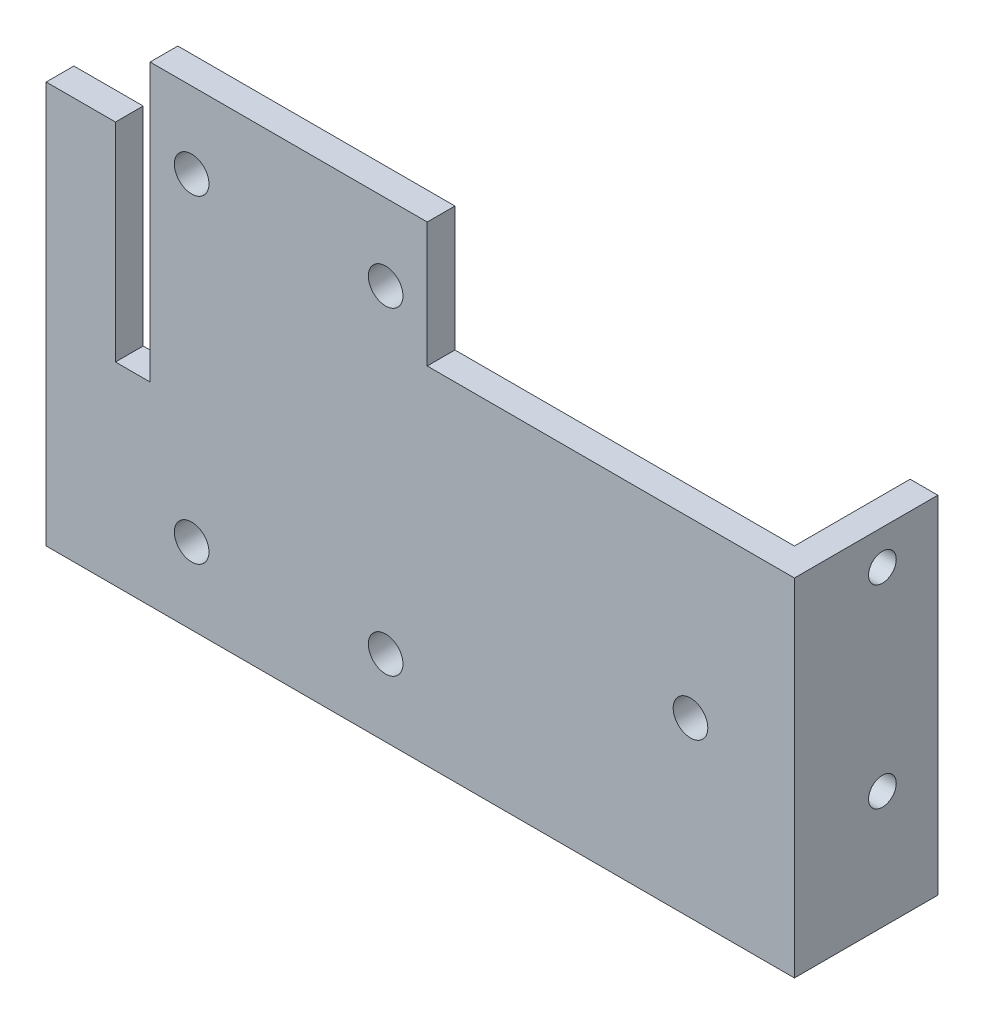
ISO-10303-21;
HEADER;
FILE_DESCRIPTION(('STEP AP214'),'2;1');
FILE_NAME('part.step','',(''),(''),'','','');
FILE_SCHEMA(('AUTOMOTIVE_DESIGN { 1 0 10303 214 1 1 1 1 }'));
ENDSEC;
DATA;
#1=APPLICATION_CONTEXT('core data for automotive mechanical design processes');
#2=APPLICATION_PROTOCOL_DEFINITION('international standard','automotive_design',2000,#1);
#3=PRODUCT_CONTEXT('',#1,'mechanical');
#4=PRODUCT('Part','Part','',(#3));
#5=PRODUCT_RELATED_PRODUCT_CATEGORY('part','',(#4));
#6=PRODUCT_DEFINITION_FORMATION('','',#4);
#7=PRODUCT_DEFINITION_CONTEXT('part definition',#1,'design');
#8=PRODUCT_DEFINITION('design','',#6,#7);
#9=PRODUCT_DEFINITION_SHAPE('','',#8);
#10=(LENGTH_UNIT() NAMED_UNIT(*) SI_UNIT(.MILLI.,.METRE.));
#11=(NAMED_UNIT(*) PLANE_ANGLE_UNIT() SI_UNIT($,.RADIAN.));
#12=(NAMED_UNIT(*) SI_UNIT($,.STERADIAN.) SOLID_ANGLE_UNIT());
#13=UNCERTAINTY_MEASURE_WITH_UNIT(LENGTH_MEASURE(1.E-05),#10,'distance_accuracy_value','');
#14=(GEOMETRIC_REPRESENTATION_CONTEXT(3) GLOBAL_UNCERTAINTY_ASSIGNED_CONTEXT((#13)) GLOBAL_UNIT_ASSIGNED_CONTEXT((#10,
#11,#12)) REPRESENTATION_CONTEXT('',''));
#15=CARTESIAN_POINT('',(0.,0.,0.));
#16=DIRECTION('',(0.,0.,1.));
#17=DIRECTION('',(1.,0.,0.));
#18=AXIS2_PLACEMENT_3D('',#15,#16,#17);
#19=CARTESIAN_POINT('',(0.,0.,4.));
#20=DIRECTION('',(0.,0.,-1.));
#21=DIRECTION('',(-1.,0.,0.));
#22=AXIS2_PLACEMENT_3D('',#19,#20,#21);
#23=PLANE('',#22);
#24=DIRECTION('',(0.,1.,0.));
#25=VECTOR('',#24,1.);
#26=CARTESIAN_POINT('',(9.99999999999999,0.,4.));
#27=LINE('',#26,#25);
#28=CARTESIAN_POINT('',(9.99999999999999,28.,4.));
#29=VERTEX_POINT('',#28);
#30=CARTESIAN_POINT('',(10.,58.,4.));
#31=VERTEX_POINT('',#30);
#32=EDGE_CURVE('E179',#29,#31,#27,.T.);
#33=ORIENTED_EDGE('',*,*,#32,.T.);
#34=DIRECTION('',(-1.,0.,0.));
#35=VECTOR('',#34,1.);
#36=CARTESIAN_POINT('',(0.,58.,4.));
#37=LINE('',#36,#35);
#38=CARTESIAN_POINT('',(0.,58.,4.));
#39=VERTEX_POINT('',#38);
#40=EDGE_CURVE('E282',#31,#39,#37,.T.);
#41=ORIENTED_EDGE('',*,*,#40,.T.);
#42=DIRECTION('',(0.,-1.,0.));
#43=VECTOR('',#42,1.);
#44=CARTESIAN_POINT('',(0.,0.,4.));
#45=LINE('',#44,#43);
#46=CARTESIAN_POINT('',(0.,0.,4.));
#47=VERTEX_POINT('',#46);
#48=EDGE_CURVE('E147',#39,#47,#45,.T.);
#49=ORIENTED_EDGE('',*,*,#48,.T.);
#50=DIRECTION('',(1.,0.,0.));
#51=VECTOR('',#50,1.);
#52=CARTESIAN_POINT('',(0.,0.,4.));
#53=LINE('',#52,#51);
#54=CARTESIAN_POINT('',(108.,0.,4.));
#55=VERTEX_POINT('',#54);
#56=EDGE_CURVE('E150',#47,#55,#53,.T.);
#57=ORIENTED_EDGE('',*,*,#56,.T.);
#58=DIRECTION('',(0.,1.,0.));
#59=VECTOR('',#58,1.);
#60=CARTESIAN_POINT('',(108.,0.,4.));
#61=LINE('',#60,#59);
#62=CARTESIAN_POINT('',(108.,50.,4.));
#63=VERTEX_POINT('',#62);
#64=EDGE_CURVE('E235',#55,#63,#61,.T.);
#65=ORIENTED_EDGE('',*,*,#64,.T.);
#66=DIRECTION('',(-1.,0.,0.));
#67=VECTOR('',#66,1.);
#68=CARTESIAN_POINT('',(55.,50.,4.));
#69=LINE('',#68,#67);
#70=CARTESIAN_POINT('',(55.,50.,4.));
#71=VERTEX_POINT('',#70);
#72=EDGE_CURVE('E237',#63,#71,#69,.T.);
#73=ORIENTED_EDGE('',*,*,#72,.T.);
#74=DIRECTION('',(0.,1.,0.));
#75=VECTOR('',#74,1.);
#76=CARTESIAN_POINT('',(55.,68.,4.));
#77=LINE('',#76,#75);
#78=CARTESIAN_POINT('',(55.,68.,4.));
#79=VERTEX_POINT('',#78);
#80=EDGE_CURVE('E239',#71,#79,#77,.T.);
#81=ORIENTED_EDGE('',*,*,#80,.T.);
#82=DIRECTION('',(-1.,0.,0.));
#83=VECTOR('',#82,1.);
#84=CARTESIAN_POINT('',(0.,68.,4.));
#85=LINE('',#84,#83);
#86=CARTESIAN_POINT('',(15.,68.,4.));
#87=VERTEX_POINT('',#86);
#88=EDGE_CURVE('E158',#79,#87,#85,.T.);
#89=ORIENTED_EDGE('',*,*,#88,.T.);
#90=DIRECTION('',(0.,-1.,0.));
#91=VECTOR('',#90,1.);
#92=CARTESIAN_POINT('',(15.,0.,4.));
#93=LINE('',#92,#91);
#94=CARTESIAN_POINT('',(15.,28.,4.));
#95=VERTEX_POINT('',#94);
#96=EDGE_CURVE('E52',#87,#95,#93,.T.);
#97=ORIENTED_EDGE('',*,*,#96,.T.);
#98=DIRECTION('',(-1.,0.,0.));
#99=VECTOR('',#98,1.);
#100=CARTESIAN_POINT('',(0.,28.,4.));
#101=LINE('',#100,#99);
#102=EDGE_CURVE('E184',#95,#29,#101,.T.);
#103=ORIENTED_EDGE('',*,*,#102,.T.);
#104=EDGE_LOOP('',(#33,#41,#49,#57,#65,#73,#81,#89,#97,#103));
#105=FACE_BOUND('',#104,.T.);
#106=CARTESIAN_POINT('',(21.,57.,4.));
#107=DIRECTION('',(0.,0.,1.));
#108=DIRECTION('',(1.,0.,0.));
#109=AXIS2_PLACEMENT_3D('',#106,#107,#108);
#110=CIRCLE('',#109,2.5);
#111=CARTESIAN_POINT('',(23.5,57.,4.));
#112=VERTEX_POINT('',#111);
#113=EDGE_CURVE('E228',#112,#112,#110,.T.);
#114=ORIENTED_EDGE('',*,*,#113,.F.);
#115=EDGE_LOOP('',(#114));
#116=FACE_BOUND('',#115,.T.);
#117=CARTESIAN_POINT('',(49.,57.,4.));
#118=DIRECTION('',(0.,0.,1.));
#119=DIRECTION('',(1.,0.,0.));
#120=AXIS2_PLACEMENT_3D('',#117,#118,#119);
#121=CIRCLE('',#120,2.5);
#122=CARTESIAN_POINT('',(51.5,57.,4.));
#123=VERTEX_POINT('',#122);
#124=EDGE_CURVE('E222',#123,#123,#121,.T.);
#125=ORIENTED_EDGE('',*,*,#124,.F.);
#126=EDGE_LOOP('',(#125));
#127=FACE_BOUND('',#126,.T.);
#128=CARTESIAN_POINT('',(21.,11.,4.));
#129=DIRECTION('',(0.,0.,1.));
#130=DIRECTION('',(1.,0.,0.));
#131=AXIS2_PLACEMENT_3D('',#128,#129,#130);
#132=CIRCLE('',#131,2.5);
#133=CARTESIAN_POINT('',(23.5,11.,4.));
#134=VERTEX_POINT('',#133);
#135=EDGE_CURVE('E216',#134,#134,#132,.T.);
#136=ORIENTED_EDGE('',*,*,#135,.F.);
#137=EDGE_LOOP('',(#136));
#138=FACE_BOUND('',#137,.T.);
#139=CARTESIAN_POINT('',(49.,11.,4.));
#140=DIRECTION('',(0.,0.,1.));
#141=DIRECTION('',(1.,0.,0.));
#142=AXIS2_PLACEMENT_3D('',#139,#140,#141);
#143=CIRCLE('',#142,2.5);
#144=CARTESIAN_POINT('',(51.5,11.,4.));
#145=VERTEX_POINT('',#144);
#146=EDGE_CURVE('E210',#145,#145,#143,.T.);
#147=ORIENTED_EDGE('',*,*,#146,.F.);
#148=EDGE_LOOP('',(#147));
#149=FACE_BOUND('',#148,.T.);
#150=CARTESIAN_POINT('',(93.,25.,4.));
#151=DIRECTION('',(0.,0.,1.));
#152=DIRECTION('',(1.,0.,0.));
#153=AXIS2_PLACEMENT_3D('',#150,#151,#152);
#154=CIRCLE('',#153,2.5);
#155=CARTESIAN_POINT('',(95.5,25.,4.));
#156=VERTEX_POINT('',#155);
#157=EDGE_CURVE('E204',#156,#156,#154,.T.);
#158=ORIENTED_EDGE('',*,*,#157,.F.);
#159=EDGE_LOOP('',(#158));
#160=FACE_BOUND('',#159,.T.);
#161=ADVANCED_FACE('F37',(#105,#116,#127,#138,#149,#160),#23,.F.);
#162=CARTESIAN_POINT('',(0.,0.,0.));
#163=DIRECTION('',(0.,0.,-1.));
#164=DIRECTION('',(-1.,0.,0.));
#165=AXIS2_PLACEMENT_3D('',#162,#163,#164);
#166=PLANE('',#165);
#167=DIRECTION('',(-1.,0.,0.));
#168=VECTOR('',#167,1.);
#169=CARTESIAN_POINT('',(0.,58.,0.));
#170=LINE('',#169,#168);
#171=CARTESIAN_POINT('',(10.,58.,0.));
#172=VERTEX_POINT('',#171);
#173=CARTESIAN_POINT('',(0.,58.,0.));
#174=VERTEX_POINT('',#173);
#175=EDGE_CURVE('E287',#172,#174,#170,.T.);
#176=ORIENTED_EDGE('',*,*,#175,.F.);
#177=DIRECTION('',(0.,1.,0.));
#178=VECTOR('',#177,1.);
#179=CARTESIAN_POINT('',(10.,58.,0.));
#180=LINE('',#179,#178);
#181=CARTESIAN_POINT('',(9.99999999999999,28.,0.));
#182=VERTEX_POINT('',#181);
#183=EDGE_CURVE('E301',#182,#172,#180,.T.);
#184=ORIENTED_EDGE('',*,*,#183,.F.);
#185=DIRECTION('',(-1.,0.,0.));
#186=VECTOR('',#185,1.);
#187=CARTESIAN_POINT('',(15.,28.,0.));
#188=LINE('',#187,#186);
#189=CARTESIAN_POINT('',(15.,28.,0.));
#190=VERTEX_POINT('',#189);
#191=EDGE_CURVE('E141',#190,#182,#188,.T.);
#192=ORIENTED_EDGE('',*,*,#191,.F.);
#193=DIRECTION('',(0.,-1.,0.));
#194=VECTOR('',#193,1.);
#195=CARTESIAN_POINT('',(15.,48.,0.));
#196=LINE('',#195,#194);
#197=CARTESIAN_POINT('',(15.,68.,0.));
#198=VERTEX_POINT('',#197);
#199=EDGE_CURVE('E126',#198,#190,#196,.T.);
#200=ORIENTED_EDGE('',*,*,#199,.F.);
#201=DIRECTION('',(-1.,0.,0.));
#202=VECTOR('',#201,1.);
#203=CARTESIAN_POINT('',(0.,68.,0.));
#204=LINE('',#203,#202);
#205=CARTESIAN_POINT('',(55.,68.,0.));
#206=VERTEX_POINT('',#205);
#207=EDGE_CURVE('E138',#206,#198,#204,.T.);
#208=ORIENTED_EDGE('',*,*,#207,.F.);
#209=DIRECTION('',(0.,1.,0.));
#210=VECTOR('',#209,1.);
#211=CARTESIAN_POINT('',(55.,68.,0.));
#212=LINE('',#211,#210);
#213=CARTESIAN_POINT('',(55.,50.,0.));
#214=VERTEX_POINT('',#213);
#215=EDGE_CURVE('E148',#214,#206,#212,.T.);
#216=ORIENTED_EDGE('',*,*,#215,.F.);
#217=DIRECTION('',(-1.,0.,0.));
#218=VECTOR('',#217,1.);
#219=CARTESIAN_POINT('',(55.,50.,0.));
#220=LINE('',#219,#218);
#221=CARTESIAN_POINT('',(104.,50.,0.));
#222=VERTEX_POINT('',#221);
#223=EDGE_CURVE('E152',#222,#214,#220,.T.);
#224=ORIENTED_EDGE('',*,*,#223,.F.);
#225=DIRECTION('',(0.,1.,0.));
#226=VECTOR('',#225,1.);
#227=CARTESIAN_POINT('',(104.,0.,0.));
#228=LINE('',#227,#226);
#229=CARTESIAN_POINT('',(104.,0.,0.));
#230=VERTEX_POINT('',#229);
#231=EDGE_CURVE('E200',#230,#222,#228,.T.);
#232=ORIENTED_EDGE('',*,*,#231,.F.);
#233=DIRECTION('',(1.,0.,0.));
#234=VECTOR('',#233,1.);
#235=CARTESIAN_POINT('',(0.,0.,0.));
#236=LINE('',#235,#234);
#237=CARTESIAN_POINT('',(0.,0.,0.));
#238=VERTEX_POINT('',#237);
#239=EDGE_CURVE('E243',#238,#230,#236,.T.);
#240=ORIENTED_EDGE('',*,*,#239,.F.);
#241=DIRECTION('',(0.,-1.,0.));
#242=VECTOR('',#241,1.);
#243=CARTESIAN_POINT('',(0.,0.,0.));
#244=LINE('',#243,#242);
#245=EDGE_CURVE('E231',#174,#238,#244,.T.);
#246=ORIENTED_EDGE('',*,*,#245,.F.);
#247=EDGE_LOOP('',(#176,#184,#192,#200,#208,#216,#224,#232,#240,#246));
#248=FACE_BOUND('',#247,.T.);
#249=CARTESIAN_POINT('',(49.,11.,0.));
#250=DIRECTION('',(0.,0.,1.));
#251=DIRECTION('',(1.,0.,0.));
#252=AXIS2_PLACEMENT_3D('',#249,#250,#251);
#253=CIRCLE('',#252,2.5);
#254=CARTESIAN_POINT('',(51.5,11.,0.));
#255=VERTEX_POINT('',#254);
#256=EDGE_CURVE('E207',#255,#255,#253,.T.);
#257=ORIENTED_EDGE('',*,*,#256,.T.);
#258=EDGE_LOOP('',(#257));
#259=FACE_BOUND('',#258,.T.);
#260=CARTESIAN_POINT('',(49.,57.,0.));
#261=DIRECTION('',(0.,0.,1.));
#262=DIRECTION('',(1.,0.,0.));
#263=AXIS2_PLACEMENT_3D('',#260,#261,#262);
#264=CIRCLE('',#263,2.5);
#265=CARTESIAN_POINT('',(51.5,57.,0.));
#266=VERTEX_POINT('',#265);
#267=EDGE_CURVE('E219',#266,#266,#264,.T.);
#268=ORIENTED_EDGE('',*,*,#267,.T.);
#269=EDGE_LOOP('',(#268));
#270=FACE_BOUND('',#269,.T.);
#271=CARTESIAN_POINT('',(21.,57.,0.));
#272=DIRECTION('',(0.,0.,1.));
#273=DIRECTION('',(1.,0.,0.));
#274=AXIS2_PLACEMENT_3D('',#271,#272,#273);
#275=CIRCLE('',#274,2.5);
#276=CARTESIAN_POINT('',(23.5,57.,0.));
#277=VERTEX_POINT('',#276);
#278=EDGE_CURVE('E225',#277,#277,#275,.T.);
#279=ORIENTED_EDGE('',*,*,#278,.T.);
#280=EDGE_LOOP('',(#279));
#281=FACE_BOUND('',#280,.T.);
#282=CARTESIAN_POINT('',(21.,11.,0.));
#283=DIRECTION('',(0.,0.,1.));
#284=DIRECTION('',(1.,0.,0.));
#285=AXIS2_PLACEMENT_3D('',#282,#283,#284);
#286=CIRCLE('',#285,2.5);
#287=CARTESIAN_POINT('',(23.5,11.,0.));
#288=VERTEX_POINT('',#287);
#289=EDGE_CURVE('E213',#288,#288,#286,.T.);
#290=ORIENTED_EDGE('',*,*,#289,.T.);
#291=EDGE_LOOP('',(#290));
#292=FACE_BOUND('',#291,.T.);
#293=CARTESIAN_POINT('',(93.,25.,0.));
#294=DIRECTION('',(0.,0.,1.));
#295=DIRECTION('',(1.,0.,0.));
#296=AXIS2_PLACEMENT_3D('',#293,#294,#295);
#297=CIRCLE('',#296,2.5);
#298=CARTESIAN_POINT('',(95.5,25.,0.));
#299=VERTEX_POINT('',#298);
#300=EDGE_CURVE('E203',#299,#299,#297,.T.);
#301=ORIENTED_EDGE('',*,*,#300,.T.);
#302=EDGE_LOOP('',(#301));
#303=FACE_BOUND('',#302,.T.);
#304=ADVANCED_FACE('F135',(#248,#259,#270,#281,#292,#303),#166,.T.);
#305=CARTESIAN_POINT('',(0.,0.,4.));
#306=DIRECTION('',(1.,0.,0.));
#307=DIRECTION('',(0.,0.,-1.));
#308=AXIS2_PLACEMENT_3D('',#305,#306,#307);
#309=PLANE('',#308);
#310=ORIENTED_EDGE('',*,*,#48,.F.);
#311=DIRECTION('',(0.,0.,-1.));
#312=VECTOR('',#311,1.);
#313=CARTESIAN_POINT('',(0.,58.,10.));
#314=LINE('',#313,#312);
#315=EDGE_CURVE('E277',#39,#174,#314,.T.);
#316=ORIENTED_EDGE('',*,*,#315,.T.);
#317=ORIENTED_EDGE('',*,*,#245,.T.);
#318=DIRECTION('',(0.,0.,-1.));
#319=VECTOR('',#318,1.);
#320=CARTESIAN_POINT('',(0.,0.,4.));
#321=LINE('',#320,#319);
#322=EDGE_CURVE('E45',#47,#238,#321,.T.);
#323=ORIENTED_EDGE('',*,*,#322,.F.);
#324=EDGE_LOOP('',(#310,#316,#317,#323));
#325=FACE_BOUND('',#324,.T.);
#326=ADVANCED_FACE('F39',(#325),#309,.F.);
#327=CARTESIAN_POINT('',(0.,0.,4.));
#328=DIRECTION('',(0.,1.,0.));
#329=DIRECTION('',(0.,0.,1.));
#330=AXIS2_PLACEMENT_3D('',#327,#328,#329);
#331=PLANE('',#330);
#332=ORIENTED_EDGE('',*,*,#239,.T.);
#333=DIRECTION('',(0.,0.,1.));
#334=VECTOR('',#333,1.);
#335=CARTESIAN_POINT('',(104.,0.,-16.7));
#336=LINE('',#335,#334);
#337=CARTESIAN_POINT('',(104.,0.,-16.7));
#338=VERTEX_POINT('',#337);
#339=EDGE_CURVE('E198',#338,#230,#336,.T.);
#340=ORIENTED_EDGE('',*,*,#339,.F.);
#341=DIRECTION('',(1.,0.,0.));
#342=VECTOR('',#341,1.);
#343=CARTESIAN_POINT('',(108.,0.,-16.7));
#344=LINE('',#343,#342);
#345=CARTESIAN_POINT('',(108.,0.,-16.7));
#346=VERTEX_POINT('',#345);
#347=EDGE_CURVE('E195',#338,#346,#344,.T.);
#348=ORIENTED_EDGE('',*,*,#347,.T.);
#349=DIRECTION('',(0.,0.,-1.));
#350=VECTOR('',#349,1.);
#351=CARTESIAN_POINT('',(108.,0.,4.));
#352=LINE('',#351,#350);
#353=EDGE_CURVE('E163',#55,#346,#352,.T.);
#354=ORIENTED_EDGE('',*,*,#353,.F.);
#355=ORIENTED_EDGE('',*,*,#56,.F.);
#356=ORIENTED_EDGE('',*,*,#322,.T.);
#357=EDGE_LOOP('',(#332,#340,#348,#354,#355,#356));
#358=FACE_BOUND('',#357,.T.);
#359=ADVANCED_FACE('F268',(#358),#331,.F.);
#360=CARTESIAN_POINT('',(108.,0.,4.));
#361=DIRECTION('',(-1.,0.,0.));
#362=DIRECTION('',(0.,0.,1.));
#363=AXIS2_PLACEMENT_3D('',#360,#361,#362);
#364=PLANE('',#363);
#365=CARTESIAN_POINT('',(108.,17.,-8.7));
#366=DIRECTION('',(1.,0.,0.));
#367=DIRECTION('',(0.,0.,-1.));
#368=AXIS2_PLACEMENT_3D('',#365,#366,#367);
#369=CIRCLE('',#368,2.);
#370=CARTESIAN_POINT('',(108.,17.,-10.7));
#371=VERTEX_POINT('',#370);
#372=EDGE_CURVE('E173',#371,#371,#369,.T.);
#373=ORIENTED_EDGE('',*,*,#372,.F.);
#374=EDGE_LOOP('',(#373));
#375=FACE_BOUND('',#374,.T.);
#376=CARTESIAN_POINT('',(108.,45.,-8.7));
#377=DIRECTION('',(1.,0.,0.));
#378=DIRECTION('',(0.,0.,-1.));
#379=AXIS2_PLACEMENT_3D('',#376,#377,#378);
#380=CIRCLE('',#379,2.);
#381=CARTESIAN_POINT('',(108.,45.,-10.7));
#382=VERTEX_POINT('',#381);
#383=EDGE_CURVE('E170',#382,#382,#380,.T.);
#384=ORIENTED_EDGE('',*,*,#383,.F.);
#385=EDGE_LOOP('',(#384));
#386=FACE_BOUND('',#385,.T.);
#387=ORIENTED_EDGE('',*,*,#353,.T.);
#388=DIRECTION('',(0.,1.,0.));
#389=VECTOR('',#388,1.);
#390=CARTESIAN_POINT('',(108.,50.,-16.7));
#391=LINE('',#390,#389);
#392=CARTESIAN_POINT('',(108.,50.,-16.7));
#393=VERTEX_POINT('',#392);
#394=EDGE_CURVE('E169',#346,#393,#391,.T.);
#395=ORIENTED_EDGE('',*,*,#394,.T.);
#396=DIRECTION('',(0.,0.,-1.));
#397=VECTOR('',#396,1.);
#398=CARTESIAN_POINT('',(108.,50.,4.));
#399=LINE('',#398,#397);
#400=EDGE_CURVE('E161',#63,#393,#399,.T.);
#401=ORIENTED_EDGE('',*,*,#400,.F.);
#402=ORIENTED_EDGE('',*,*,#64,.F.);
#403=EDGE_LOOP('',(#387,#395,#401,#402));
#404=FACE_BOUND('',#403,.T.);
#405=ADVANCED_FACE('F264',(#375,#386,#404),#364,.F.);
#406=CARTESIAN_POINT('',(55.,50.,4.));
#407=DIRECTION('',(0.,-1.,0.));
#408=DIRECTION('',(0.,0.,-1.));
#409=AXIS2_PLACEMENT_3D('',#406,#407,#408);
#410=PLANE('',#409);
#411=DIRECTION('',(0.,0.,-1.));
#412=VECTOR('',#411,1.);
#413=CARTESIAN_POINT('',(55.,50.,4.));
#414=LINE('',#413,#412);
#415=EDGE_CURVE('E157',#71,#214,#414,.T.);
#416=ORIENTED_EDGE('',*,*,#415,.F.);
#417=ORIENTED_EDGE('',*,*,#72,.F.);
#418=ORIENTED_EDGE('',*,*,#400,.T.);
#419=DIRECTION('',(-1.,0.,0.));
#420=VECTOR('',#419,1.);
#421=CARTESIAN_POINT('',(108.,50.,-16.7));
#422=LINE('',#421,#420);
#423=CARTESIAN_POINT('',(104.,50.,-16.7));
#424=VERTEX_POINT('',#423);
#425=EDGE_CURVE('E190',#393,#424,#422,.T.);
#426=ORIENTED_EDGE('',*,*,#425,.T.);
#427=DIRECTION('',(0.,0.,1.));
#428=VECTOR('',#427,1.);
#429=CARTESIAN_POINT('',(104.,50.,-16.7));
#430=LINE('',#429,#428);
#431=EDGE_CURVE('E59',#424,#222,#430,.T.);
#432=ORIENTED_EDGE('',*,*,#431,.T.);
#433=ORIENTED_EDGE('',*,*,#223,.T.);
#434=EDGE_LOOP('',(#416,#417,#418,#426,#432,#433));
#435=FACE_BOUND('',#434,.T.);
#436=ADVANCED_FACE('F247',(#435),#410,.F.);
#437=CARTESIAN_POINT('',(55.,68.,4.));
#438=DIRECTION('',(-1.,0.,0.));
#439=DIRECTION('',(0.,-1.,0.));
#440=AXIS2_PLACEMENT_3D('',#437,#438,#439);
#441=PLANE('',#440);
#442=ORIENTED_EDGE('',*,*,#215,.T.);
#443=DIRECTION('',(0.,0.,-1.));
#444=VECTOR('',#443,1.);
#445=CARTESIAN_POINT('',(55.,68.,4.));
#446=LINE('',#445,#444);
#447=EDGE_CURVE('E146',#79,#206,#446,.T.);
#448=ORIENTED_EDGE('',*,*,#447,.F.);
#449=ORIENTED_EDGE('',*,*,#80,.F.);
#450=ORIENTED_EDGE('',*,*,#415,.T.);
#451=EDGE_LOOP('',(#442,#448,#449,#450));
#452=FACE_BOUND('',#451,.T.);
#453=ADVANCED_FACE('F252',(#452),#441,.F.);
#454=CARTESIAN_POINT('',(0.,68.,4.));
#455=DIRECTION('',(0.,-1.,0.));
#456=DIRECTION('',(0.,0.,-1.));
#457=AXIS2_PLACEMENT_3D('',#454,#455,#456);
#458=PLANE('',#457);
#459=ORIENTED_EDGE('',*,*,#207,.T.);
#460=DIRECTION('',(0.,0.,1.));
#461=VECTOR('',#460,1.);
#462=CARTESIAN_POINT('',(15.,68.,4.));
#463=LINE('',#462,#461);
#464=EDGE_CURVE('E11',#198,#87,#463,.T.);
#465=ORIENTED_EDGE('',*,*,#464,.T.);
#466=ORIENTED_EDGE('',*,*,#88,.F.);
#467=ORIENTED_EDGE('',*,*,#447,.T.);
#468=EDGE_LOOP('',(#459,#465,#466,#467));
#469=FACE_BOUND('',#468,.T.);
#470=ADVANCED_FACE('F144',(#469),#458,.F.);
#471=CARTESIAN_POINT('',(21.,57.,4.));
#472=DIRECTION('',(0.,0.,-1.));
#473=DIRECTION('',(-1.,0.,0.));
#474=AXIS2_PLACEMENT_3D('',#471,#472,#473);
#475=CYLINDRICAL_SURFACE('',#474,2.5);
#476=ORIENTED_EDGE('',*,*,#113,.T.);
#477=EDGE_LOOP('',(#476));
#478=FACE_BOUND('',#477,.T.);
#479=ORIENTED_EDGE('',*,*,#278,.F.);
#480=EDGE_LOOP('',(#479));
#481=FACE_BOUND('',#480,.T.);
#482=ADVANCED_FACE('F320',(#478,#481),#475,.F.);
#483=CARTESIAN_POINT('',(49.,57.,4.));
#484=DIRECTION('',(0.,0.,-1.));
#485=DIRECTION('',(-1.,0.,0.));
#486=AXIS2_PLACEMENT_3D('',#483,#484,#485);
#487=CYLINDRICAL_SURFACE('',#486,2.5);
#488=ORIENTED_EDGE('',*,*,#124,.T.);
#489=EDGE_LOOP('',(#488));
#490=FACE_BOUND('',#489,.T.);
#491=ORIENTED_EDGE('',*,*,#267,.F.);
#492=EDGE_LOOP('',(#491));
#493=FACE_BOUND('',#492,.T.);
#494=ADVANCED_FACE('F433',(#490,#493),#487,.F.);
#495=CARTESIAN_POINT('',(21.,11.,4.));
#496=DIRECTION('',(0.,0.,-1.));
#497=DIRECTION('',(-1.,0.,0.));
#498=AXIS2_PLACEMENT_3D('',#495,#496,#497);
#499=CYLINDRICAL_SURFACE('',#498,2.5);
#500=ORIENTED_EDGE('',*,*,#135,.T.);
#501=EDGE_LOOP('',(#500));
#502=FACE_BOUND('',#501,.T.);
#503=ORIENTED_EDGE('',*,*,#289,.F.);
#504=EDGE_LOOP('',(#503));
#505=FACE_BOUND('',#504,.T.);
#506=ADVANCED_FACE('F423',(#502,#505),#499,.F.);
#507=CARTESIAN_POINT('',(49.,11.,4.));
#508=DIRECTION('',(0.,0.,-1.));
#509=DIRECTION('',(-1.,0.,0.));
#510=AXIS2_PLACEMENT_3D('',#507,#508,#509);
#511=CYLINDRICAL_SURFACE('',#510,2.5);
#512=ORIENTED_EDGE('',*,*,#146,.T.);
#513=EDGE_LOOP('',(#512));
#514=FACE_BOUND('',#513,.T.);
#515=ORIENTED_EDGE('',*,*,#256,.F.);
#516=EDGE_LOOP('',(#515));
#517=FACE_BOUND('',#516,.T.);
#518=ADVANCED_FACE('F413',(#514,#517),#511,.F.);
#519=CARTESIAN_POINT('',(93.,25.,4.));
#520=DIRECTION('',(0.,0.,-1.));
#521=DIRECTION('',(-1.,0.,0.));
#522=AXIS2_PLACEMENT_3D('',#519,#520,#521);
#523=CYLINDRICAL_SURFACE('',#522,2.5);
#524=ORIENTED_EDGE('',*,*,#157,.T.);
#525=EDGE_LOOP('',(#524));
#526=FACE_BOUND('',#525,.T.);
#527=ORIENTED_EDGE('',*,*,#300,.F.);
#528=EDGE_LOOP('',(#527));
#529=FACE_BOUND('',#528,.T.);
#530=ADVANCED_FACE('F378',(#526,#529),#523,.F.);
#531=CARTESIAN_POINT('',(104.,50.,-16.7));
#532=DIRECTION('',(-1.,0.,0.));
#533=DIRECTION('',(0.,0.,1.));
#534=AXIS2_PLACEMENT_3D('',#531,#532,#533);
#535=PLANE('',#534);
#536=CARTESIAN_POINT('',(104.,17.,-8.7));
#537=DIRECTION('',(-1.,0.,0.));
#538=DIRECTION('',(0.,0.,1.));
#539=AXIS2_PLACEMENT_3D('',#536,#537,#538);
#540=CIRCLE('',#539,2.);
#541=CARTESIAN_POINT('',(104.,17.,-6.7));
#542=VERTEX_POINT('',#541);
#543=EDGE_CURVE('E171',#542,#542,#540,.T.);
#544=ORIENTED_EDGE('',*,*,#543,.F.);
#545=EDGE_LOOP('',(#544));
#546=FACE_BOUND('',#545,.T.);
#547=CARTESIAN_POINT('',(104.,45.,-8.7));
#548=DIRECTION('',(-1.,0.,0.));
#549=DIRECTION('',(0.,0.,1.));
#550=AXIS2_PLACEMENT_3D('',#547,#548,#549);
#551=CIRCLE('',#550,2.);
#552=CARTESIAN_POINT('',(104.,45.,-6.7));
#553=VERTEX_POINT('',#552);
#554=EDGE_CURVE('E167',#553,#553,#551,.T.);
#555=ORIENTED_EDGE('',*,*,#554,.F.);
#556=EDGE_LOOP('',(#555));
#557=FACE_BOUND('',#556,.T.);
#558=ORIENTED_EDGE('',*,*,#339,.T.);
#559=ORIENTED_EDGE('',*,*,#231,.T.);
#560=ORIENTED_EDGE('',*,*,#431,.F.);
#561=DIRECTION('',(0.,-1.,0.));
#562=VECTOR('',#561,1.);
#563=CARTESIAN_POINT('',(104.,50.,-16.7));
#564=LINE('',#563,#562);
#565=EDGE_CURVE('E192',#424,#338,#564,.T.);
#566=ORIENTED_EDGE('',*,*,#565,.T.);
#567=EDGE_LOOP('',(#558,#559,#560,#566));
#568=FACE_BOUND('',#567,.T.);
#569=ADVANCED_FACE('F272',(#546,#557,#568),#535,.T.);
#570=CARTESIAN_POINT('',(0.,0.,-16.7));
#571=DIRECTION('',(0.,0.,-1.));
#572=DIRECTION('',(-1.,0.,0.));
#573=AXIS2_PLACEMENT_3D('',#570,#571,#572);
#574=PLANE('',#573);
#575=ORIENTED_EDGE('',*,*,#394,.F.);
#576=ORIENTED_EDGE('',*,*,#347,.F.);
#577=ORIENTED_EDGE('',*,*,#565,.F.);
#578=ORIENTED_EDGE('',*,*,#425,.F.);
#579=EDGE_LOOP('',(#575,#576,#577,#578));
#580=FACE_BOUND('',#579,.T.);
#581=ADVANCED_FACE('F262',(#580),#574,.T.);
#582=CARTESIAN_POINT('',(101.3,45.,-8.7));
#583=DIRECTION('',(1.,0.,0.));
#584=DIRECTION('',(0.,0.,-1.));
#585=AXIS2_PLACEMENT_3D('',#582,#583,#584);
#586=CYLINDRICAL_SURFACE('',#585,2.);
#587=ORIENTED_EDGE('',*,*,#554,.T.);
#588=EDGE_LOOP('',(#587));
#589=FACE_BOUND('',#588,.T.);
#590=ORIENTED_EDGE('',*,*,#383,.T.);
#591=EDGE_LOOP('',(#590));
#592=FACE_BOUND('',#591,.T.);
#593=ADVANCED_FACE('F356',(#589,#592),#586,.F.);
#594=CARTESIAN_POINT('',(101.3,17.,-8.7));
#595=DIRECTION('',(1.,0.,0.));
#596=DIRECTION('',(0.,0.,-1.));
#597=AXIS2_PLACEMENT_3D('',#594,#595,#596);
#598=CYLINDRICAL_SURFACE('',#597,2.);
#599=ORIENTED_EDGE('',*,*,#543,.T.);
#600=EDGE_LOOP('',(#599));
#601=FACE_BOUND('',#600,.T.);
#602=ORIENTED_EDGE('',*,*,#372,.T.);
#603=EDGE_LOOP('',(#602));
#604=FACE_BOUND('',#603,.T.);
#605=ADVANCED_FACE('F351',(#601,#604),#598,.F.);
#606=CARTESIAN_POINT('',(10.,58.,10.));
#607=DIRECTION('',(-1.,0.,0.));
#608=DIRECTION('',(0.,-1.,0.));
#609=AXIS2_PLACEMENT_3D('',#606,#607,#608);
#610=PLANE('',#609);
#611=DIRECTION('',(0.,0.,-1.));
#612=VECTOR('',#611,1.);
#613=CARTESIAN_POINT('',(9.99999999999999,28.,10.));
#614=LINE('',#613,#612);
#615=EDGE_CURVE('E284',#29,#182,#614,.T.);
#616=ORIENTED_EDGE('',*,*,#615,.T.);
#617=ORIENTED_EDGE('',*,*,#183,.T.);
#618=DIRECTION('',(0.,0.,-1.));
#619=VECTOR('',#618,1.);
#620=CARTESIAN_POINT('',(10.,58.,10.));
#621=LINE('',#620,#619);
#622=EDGE_CURVE('E280',#31,#172,#621,.T.);
#623=ORIENTED_EDGE('',*,*,#622,.F.);
#624=ORIENTED_EDGE('',*,*,#32,.F.);
#625=EDGE_LOOP('',(#616,#617,#623,#624));
#626=FACE_BOUND('',#625,.T.);
#627=ADVANCED_FACE('F299',(#626),#610,.F.);
#628=CARTESIAN_POINT('',(15.,28.,10.));
#629=DIRECTION('',(0.,-1.,0.));
#630=DIRECTION('',(1.,0.,0.));
#631=AXIS2_PLACEMENT_3D('',#628,#629,#630);
#632=PLANE('',#631);
#633=DIRECTION('',(0.,0.,-1.));
#634=VECTOR('',#633,1.);
#635=CARTESIAN_POINT('',(15.,28.,10.));
#636=LINE('',#635,#634);
#637=EDGE_CURVE('E291',#95,#190,#636,.T.);
#638=ORIENTED_EDGE('',*,*,#637,.T.);
#639=ORIENTED_EDGE('',*,*,#191,.T.);
#640=ORIENTED_EDGE('',*,*,#615,.F.);
#641=ORIENTED_EDGE('',*,*,#102,.F.);
#642=EDGE_LOOP('',(#638,#639,#640,#641));
#643=FACE_BOUND('',#642,.T.);
#644=ADVANCED_FACE('F296',(#643),#632,.F.);
#645=CARTESIAN_POINT('',(0.,58.,10.));
#646=DIRECTION('',(0.,-1.,0.));
#647=DIRECTION('',(0.,0.,-1.));
#648=AXIS2_PLACEMENT_3D('',#645,#646,#647);
#649=PLANE('',#648);
#650=ORIENTED_EDGE('',*,*,#622,.T.);
#651=ORIENTED_EDGE('',*,*,#175,.T.);
#652=ORIENTED_EDGE('',*,*,#315,.F.);
#653=ORIENTED_EDGE('',*,*,#40,.F.);
#654=EDGE_LOOP('',(#650,#651,#652,#653));
#655=FACE_BOUND('',#654,.T.);
#656=ADVANCED_FACE('F302',(#655),#649,.F.);
#657=CARTESIAN_POINT('',(15.,48.,10.));
#658=DIRECTION('',(1.,0.,0.));
#659=DIRECTION('',(0.,1.,0.));
#660=AXIS2_PLACEMENT_3D('',#657,#658,#659);
#661=PLANE('',#660);
#662=ORIENTED_EDGE('',*,*,#464,.F.);
#663=ORIENTED_EDGE('',*,*,#199,.T.);
#664=ORIENTED_EDGE('',*,*,#637,.F.);
#665=ORIENTED_EDGE('',*,*,#96,.F.);
#666=EDGE_LOOP('',(#662,#663,#664,#665));
#667=FACE_BOUND('',#666,.T.);
#668=ADVANCED_FACE('F125',(#667),#661,.F.);
#669=CLOSED_SHELL('',(#161,#304,#326,#359,#405,#436,#453,#470,#482,#494,#506,#518,#530,#569,
#581,#593,#605,#627,#644,#656,#668));
#670=MANIFOLD_SOLID_BREP('B2',#669);
#671=ADVANCED_BREP_SHAPE_REPRESENTATION('',(#18,#670),#14);
#672=SHAPE_DEFINITION_REPRESENTATION(#9,#671);
ENDSEC;
END-ISO-10303-21;
